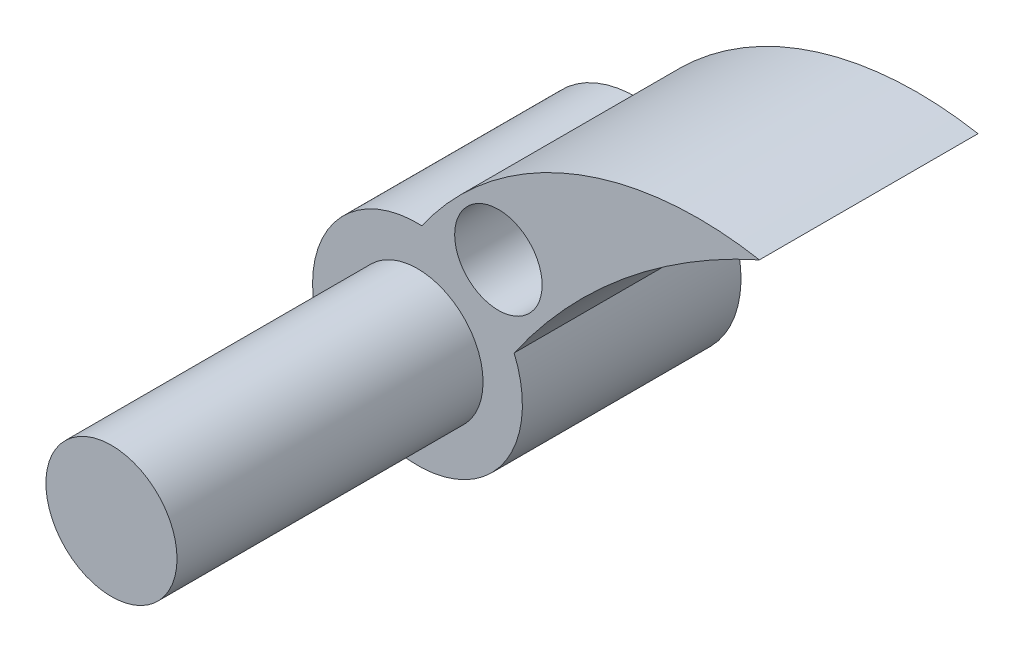
ISO-10303-21;
HEADER;
FILE_DESCRIPTION(('STEP AP214'),'2;1');
FILE_NAME('part.step','',(''),(''),'','','');
FILE_SCHEMA(('AUTOMOTIVE_DESIGN { 1 0 10303 214 1 1 1 1 }'));
ENDSEC;
DATA;
#1=APPLICATION_CONTEXT('core data for automotive mechanical design processes');
#2=APPLICATION_PROTOCOL_DEFINITION('international standard','automotive_design',2000,#1);
#3=PRODUCT_CONTEXT('',#1,'mechanical');
#4=PRODUCT('Part','Part','',(#3));
#5=PRODUCT_RELATED_PRODUCT_CATEGORY('part','',(#4));
#6=PRODUCT_DEFINITION_FORMATION('','',#4);
#7=PRODUCT_DEFINITION_CONTEXT('part definition',#1,'design');
#8=PRODUCT_DEFINITION('design','',#6,#7);
#9=PRODUCT_DEFINITION_SHAPE('','',#8);
#10=(LENGTH_UNIT() NAMED_UNIT(*) SI_UNIT(.MILLI.,.METRE.));
#11=(NAMED_UNIT(*) PLANE_ANGLE_UNIT() SI_UNIT($,.RADIAN.));
#12=(NAMED_UNIT(*) SI_UNIT($,.STERADIAN.) SOLID_ANGLE_UNIT());
#13=UNCERTAINTY_MEASURE_WITH_UNIT(LENGTH_MEASURE(1.E-05),#10,'distance_accuracy_value','');
#14=(GEOMETRIC_REPRESENTATION_CONTEXT(3) GLOBAL_UNCERTAINTY_ASSIGNED_CONTEXT((#13)) GLOBAL_UNIT_ASSIGNED_CONTEXT((#10,
#11,#12)) REPRESENTATION_CONTEXT('',''));
#15=CARTESIAN_POINT('',(0.,0.,0.));
#16=DIRECTION('',(0.,0.,1.));
#17=DIRECTION('',(1.,0.,0.));
#18=AXIS2_PLACEMENT_3D('',#15,#16,#17);
#19=CARTESIAN_POINT('',(4.9140489948625,5.41137025828641,5.));
#20=DIRECTION('',(0.,0.,-1.));
#21=DIRECTION('',(-1.,0.,0.));
#22=AXIS2_PLACEMENT_3D('',#19,#20,#21);
#23=CYLINDRICAL_SURFACE('',#22,2.4);
#24=CARTESIAN_POINT('',(4.9140489948625,5.41137025828641,0.));
#25=DIRECTION('',(0.,0.,1.));
#26=DIRECTION('',(1.,0.,0.));
#27=AXIS2_PLACEMENT_3D('',#24,#25,#26);
#28=CIRCLE('',#27,2.4);
#29=CARTESIAN_POINT('',(5.01633204058034,7.80918972158191,0.));
#30=VERTEX_POINT('',#29);
#31=CARTESIAN_POINT('',(7.12510735522439,6.34476241974577,0.));
#32=VERTEX_POINT('',#31);
#33=EDGE_CURVE('E82',#30,#32,#28,.T.);
#34=ORIENTED_EDGE('',*,*,#33,.T.);
#35=DIRECTION('',(0.,0.,-1.));
#36=VECTOR('',#35,1.);
#37=CARTESIAN_POINT('',(7.12510735522439,6.34476241974577,5.));
#38=LINE('',#37,#36);
#39=CARTESIAN_POINT('',(7.12510735522439,6.34476241974577,5.));
#40=VERTEX_POINT('',#39);
#41=EDGE_CURVE('E35',#40,#32,#38,.T.);
#42=ORIENTED_EDGE('',*,*,#41,.F.);
#43=CARTESIAN_POINT('',(4.9140489948625,5.41137025828641,5.));
#44=DIRECTION('',(0.,0.,1.));
#45=DIRECTION('',(1.,0.,0.));
#46=AXIS2_PLACEMENT_3D('',#43,#44,#45);
#47=CIRCLE('',#46,2.4);
#48=CARTESIAN_POINT('',(5.01633204058034,7.80918972158191,5.));
#49=VERTEX_POINT('',#48);
#50=EDGE_CURVE('E75',#49,#40,#47,.T.);
#51=ORIENTED_EDGE('',*,*,#50,.F.);
#52=DIRECTION('',(0.,0.,-1.));
#53=VECTOR('',#52,1.);
#54=CARTESIAN_POINT('',(5.01633204058034,7.80918972158191,5.));
#55=LINE('',#54,#53);
#56=EDGE_CURVE('E83',#49,#30,#55,.T.);
#57=ORIENTED_EDGE('',*,*,#56,.T.);
#58=EDGE_LOOP('',(#34,#42,#51,#57));
#59=FACE_BOUND('',#58,.T.);
#60=ADVANCED_FACE('F32',(#59),#23,.T.);
#61=CARTESIAN_POINT('',(18.2692608534477,-1.39423306513153,5.));
#62=DIRECTION('',(0.,0.,-1.));
#63=DIRECTION('',(-1.,0.,0.));
#64=AXIS2_PLACEMENT_3D('',#61,#62,#63);
#65=CYLINDRICAL_SURFACE('',#64,13.567763570571);
#66=CARTESIAN_POINT('',(18.2692608534477,-1.39423306513153,0.));
#67=DIRECTION('',(0.,0.,-1.));
#68=DIRECTION('',(1.,0.,0.));
#69=AXIS2_PLACEMENT_3D('',#66,#67,#68);
#70=CIRCLE('',#69,13.567763570571);
#71=CARTESIAN_POINT('',(12.7353533060841,10.9936673043478,0.));
#72=VERTEX_POINT('',#71);
#73=EDGE_CURVE('E62',#32,#72,#70,.T.);
#74=ORIENTED_EDGE('',*,*,#73,.T.);
#75=DIRECTION('',(0.,0.,-1.));
#76=VECTOR('',#75,1.);
#77=CARTESIAN_POINT('',(12.7353533060841,10.9936673043478,5.));
#78=LINE('',#77,#76);
#79=CARTESIAN_POINT('',(12.7353533060841,10.9936673043478,5.));
#80=VERTEX_POINT('',#79);
#81=EDGE_CURVE('E74',#80,#72,#78,.T.);
#82=ORIENTED_EDGE('',*,*,#81,.F.);
#83=CARTESIAN_POINT('',(18.2692608534477,-1.39423306513153,5.));
#84=DIRECTION('',(0.,0.,-1.));
#85=DIRECTION('',(1.,0.,0.));
#86=AXIS2_PLACEMENT_3D('',#83,#84,#85);
#87=CIRCLE('',#86,13.567763570571);
#88=EDGE_CURVE('E70',#40,#80,#87,.T.);
#89=ORIENTED_EDGE('',*,*,#88,.F.);
#90=ORIENTED_EDGE('',*,*,#41,.T.);
#91=EDGE_LOOP('',(#74,#82,#89,#90));
#92=FACE_BOUND('',#91,.T.);
#93=ADVANCED_FACE('F71',(#92),#65,.F.);
#94=CARTESIAN_POINT('',(11.3461725300359,3.41346715945997,5.));
#95=DIRECTION('',(0.,0.,-1.));
#96=DIRECTION('',(-1.,0.,0.));
#97=AXIS2_PLACEMENT_3D('',#94,#95,#96);
#98=CYLINDRICAL_SURFACE('',#97,7.70644259468008);
#99=CARTESIAN_POINT('',(11.3461725300359,3.41346715945997,0.));
#100=DIRECTION('',(0.,0.,1.));
#101=DIRECTION('',(1.,0.,0.));
#102=AXIS2_PLACEMENT_3D('',#99,#100,#101);
#103=CIRCLE('',#102,7.70644259468008);
#104=EDGE_CURVE('E67',#72,#30,#103,.T.);
#105=ORIENTED_EDGE('',*,*,#104,.T.);
#106=ORIENTED_EDGE('',*,*,#56,.F.);
#107=CARTESIAN_POINT('',(11.3461725300359,3.41346715945997,5.));
#108=DIRECTION('',(0.,0.,1.));
#109=DIRECTION('',(1.,0.,0.));
#110=AXIS2_PLACEMENT_3D('',#107,#108,#109);
#111=CIRCLE('',#110,7.70644259468008);
#112=EDGE_CURVE('E49',#80,#49,#111,.T.);
#113=ORIENTED_EDGE('',*,*,#112,.F.);
#114=ORIENTED_EDGE('',*,*,#81,.T.);
#115=EDGE_LOOP('',(#105,#106,#113,#114));
#116=FACE_BOUND('',#115,.T.);
#117=ADVANCED_FACE('F114',(#116),#98,.T.);
#118=CARTESIAN_POINT('',(11.5916549241551,2.00856859657744,5.));
#119=DIRECTION('',(0.,0.,1.));
#120=DIRECTION('',(1.,0.,0.));
#121=AXIS2_PLACEMENT_3D('',#118,#119,#120);
#122=PLANE('',#121);
#123=CARTESIAN_POINT('',(6.76451307593595,8.0091474549846,5.));
#124=DIRECTION('',(0.,0.,1.));
#125=DIRECTION('',(1.,0.,0.));
#126=AXIS2_PLACEMENT_3D('',#123,#124,#125);
#127=CIRCLE('',#126,1.);
#128=CARTESIAN_POINT('',(7.76451307593595,8.0091474549846,5.));
#129=VERTEX_POINT('',#128);
#130=EDGE_CURVE('E93',#129,#129,#127,.T.);
#131=ORIENTED_EDGE('',*,*,#130,.F.);
#132=EDGE_LOOP('',(#131));
#133=FACE_BOUND('',#132,.T.);
#134=CARTESIAN_POINT('',(4.9140489948625,5.41137025828641,5.));
#135=DIRECTION('',(0.,0.,1.));
#136=DIRECTION('',(1.,0.,0.));
#137=AXIS2_PLACEMENT_3D('',#134,#135,#136);
#138=CIRCLE('',#137,1.5);
#139=CARTESIAN_POINT('',(6.4140489948625,5.41137025828641,5.));
#140=VERTEX_POINT('',#139);
#141=EDGE_CURVE('E11',#140,#140,#138,.T.);
#142=ORIENTED_EDGE('',*,*,#141,.F.);
#143=EDGE_LOOP('',(#142));
#144=FACE_BOUND('',#143,.T.);
#145=ORIENTED_EDGE('',*,*,#50,.T.);
#146=ORIENTED_EDGE('',*,*,#88,.T.);
#147=ORIENTED_EDGE('',*,*,#112,.T.);
#148=EDGE_LOOP('',(#145,#146,#147));
#149=FACE_BOUND('',#148,.T.);
#150=ADVANCED_FACE('F78',(#133,#144,#149),#122,.T.);
#151=CARTESIAN_POINT('',(11.5916549241551,2.00856859657744,0.));
#152=DIRECTION('',(0.,0.,1.));
#153=DIRECTION('',(1.,0.,0.));
#154=AXIS2_PLACEMENT_3D('',#151,#152,#153);
#155=PLANE('',#154);
#156=CARTESIAN_POINT('',(6.76451307593595,8.0091474549846,0.));
#157=DIRECTION('',(0.,0.,-1.));
#158=DIRECTION('',(-1.,0.,0.));
#159=AXIS2_PLACEMENT_3D('',#156,#157,#158);
#160=CIRCLE('',#159,1.);
#161=CARTESIAN_POINT('',(5.76451307593595,8.0091474549846,0.));
#162=VERTEX_POINT('',#161);
#163=EDGE_CURVE('E96',#162,#162,#160,.T.);
#164=ORIENTED_EDGE('',*,*,#163,.F.);
#165=EDGE_LOOP('',(#164));
#166=FACE_BOUND('',#165,.T.);
#167=ORIENTED_EDGE('',*,*,#33,.F.);
#168=ORIENTED_EDGE('',*,*,#104,.F.);
#169=ORIENTED_EDGE('',*,*,#73,.F.);
#170=EDGE_LOOP('',(#167,#168,#169));
#171=FACE_BOUND('',#170,.T.);
#172=ADVANCED_FACE('F102',(#166,#171),#155,.F.);
#173=CARTESIAN_POINT('',(4.9140489948625,5.41137025828641,12.));
#174=DIRECTION('',(0.,0.,-1.));
#175=DIRECTION('',(-1.,0.,0.));
#176=AXIS2_PLACEMENT_3D('',#173,#174,#175);
#177=CYLINDRICAL_SURFACE('',#176,1.5);
#178=CARTESIAN_POINT('',(4.9140489948625,5.41137025828641,12.));
#179=DIRECTION('',(0.,0.,1.));
#180=DIRECTION('',(1.,0.,0.));
#181=AXIS2_PLACEMENT_3D('',#178,#179,#180);
#182=CIRCLE('',#181,1.5);
#183=CARTESIAN_POINT('',(6.4140489948625,5.41137025828641,12.));
#184=VERTEX_POINT('',#183);
#185=EDGE_CURVE('E89',#184,#184,#182,.T.);
#186=ORIENTED_EDGE('',*,*,#185,.F.);
#187=EDGE_LOOP('',(#186));
#188=FACE_BOUND('',#187,.T.);
#189=ORIENTED_EDGE('',*,*,#141,.T.);
#190=EDGE_LOOP('',(#189));
#191=FACE_BOUND('',#190,.T.);
#192=ADVANCED_FACE('F105',(#188,#191),#177,.T.);
#193=CARTESIAN_POINT('',(4.9140489948625,5.41137025828641,12.));
#194=DIRECTION('',(0.,0.,1.));
#195=DIRECTION('',(1.,0.,0.));
#196=AXIS2_PLACEMENT_3D('',#193,#194,#195);
#197=PLANE('',#196);
#198=ORIENTED_EDGE('',*,*,#185,.T.);
#199=EDGE_LOOP('',(#198));
#200=FACE_BOUND('',#199,.T.);
#201=ADVANCED_FACE('F111',(#200),#197,.T.);
#202=CARTESIAN_POINT('',(6.76451307593595,8.0091474549846,12.));
#203=DIRECTION('',(0.,0.,-1.));
#204=DIRECTION('',(-1.,0.,0.));
#205=AXIS2_PLACEMENT_3D('',#202,#203,#204);
#206=CYLINDRICAL_SURFACE('',#205,1.);
#207=ORIENTED_EDGE('',*,*,#130,.T.);
#208=EDGE_LOOP('',(#207));
#209=FACE_BOUND('',#208,.T.);
#210=ORIENTED_EDGE('',*,*,#163,.T.);
#211=EDGE_LOOP('',(#210));
#212=FACE_BOUND('',#211,.T.);
#213=ADVANCED_FACE('F100',(#209,#212),#206,.F.);
#214=CLOSED_SHELL('',(#60,#93,#117,#150,#172,#192,#201,#213));
#215=MANIFOLD_SOLID_BREP('B2',#214);
#216=ADVANCED_BREP_SHAPE_REPRESENTATION('',(#18,#215),#14);
#217=SHAPE_DEFINITION_REPRESENTATION(#9,#216);
ENDSEC;
END-ISO-10303-21;
